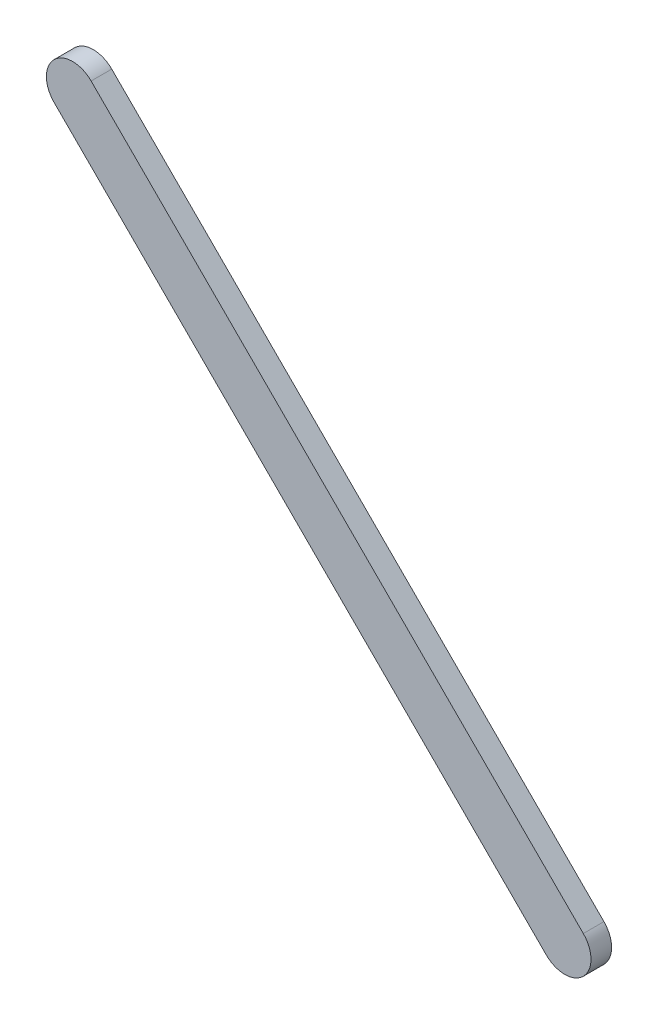
ISO-10303-21;
HEADER;
FILE_DESCRIPTION(('STEP AP214'),'2;1');
FILE_NAME('part.step','',(''),(''),'','','');
FILE_SCHEMA(('AUTOMOTIVE_DESIGN { 1 0 10303 214 1 1 1 1 }'));
ENDSEC;
DATA;
#1=APPLICATION_CONTEXT('core data for automotive mechanical design processes');
#2=APPLICATION_PROTOCOL_DEFINITION('international standard','automotive_design',2000,#1);
#3=PRODUCT_CONTEXT('',#1,'mechanical');
#4=PRODUCT('Part','Part','',(#3));
#5=PRODUCT_RELATED_PRODUCT_CATEGORY('part','',(#4));
#6=PRODUCT_DEFINITION_FORMATION('','',#4);
#7=PRODUCT_DEFINITION_CONTEXT('part definition',#1,'design');
#8=PRODUCT_DEFINITION('design','',#6,#7);
#9=PRODUCT_DEFINITION_SHAPE('','',#8);
#10=(LENGTH_UNIT() NAMED_UNIT(*) SI_UNIT(.MILLI.,.METRE.));
#11=(NAMED_UNIT(*) PLANE_ANGLE_UNIT() SI_UNIT($,.RADIAN.));
#12=(NAMED_UNIT(*) SI_UNIT($,.STERADIAN.) SOLID_ANGLE_UNIT());
#13=UNCERTAINTY_MEASURE_WITH_UNIT(LENGTH_MEASURE(1.E-05),#10,'distance_accuracy_value','');
#14=(GEOMETRIC_REPRESENTATION_CONTEXT(3) GLOBAL_UNCERTAINTY_ASSIGNED_CONTEXT((#13)) GLOBAL_UNIT_ASSIGNED_CONTEXT((#10,
#11,#12)) REPRESENTATION_CONTEXT('',''));
#15=CARTESIAN_POINT('',(0.,0.,0.));
#16=DIRECTION('',(0.,0.,1.));
#17=DIRECTION('',(1.,0.,0.));
#18=AXIS2_PLACEMENT_3D('',#15,#16,#17);
#19=CARTESIAN_POINT('',(137.03266726,101.0393966,0.));
#20=DIRECTION('',(0.707106781186548,0.707106781186548,0.));
#21=DIRECTION('',(0.707106781186548,-0.707106781186548,0.));
#22=AXIS2_PLACEMENT_3D('',#19,#20,#21);
#23=PLANE('',#22);
#24=DIRECTION('',(0.707106781186548,-0.707106781186548,0.));
#25=VECTOR('',#24,1.);
#26=CARTESIAN_POINT('',(137.03266726,101.0393966,0.1999996));
#27=LINE('',#26,#25);
#28=CARTESIAN_POINT('',(137.03266726,101.0393966,0.1999996));
#29=VERTEX_POINT('',#28);
#30=CARTESIAN_POINT('',(141.8063966,96.26566726,0.1999996));
#31=VERTEX_POINT('',#30);
#32=EDGE_CURVE('E11',#29,#31,#27,.T.);
#33=ORIENTED_EDGE('',*,*,#32,.F.);
#34=DIRECTION('',(0.,0.,1.));
#35=VECTOR('',#34,1.);
#36=CARTESIAN_POINT('',(137.03266726,101.0393966,0.));
#37=LINE('',#36,#35);
#38=CARTESIAN_POINT('',(137.03266726,101.0393966,0.));
#39=VERTEX_POINT('',#38);
#40=EDGE_CURVE('E24',#39,#29,#37,.T.);
#41=ORIENTED_EDGE('',*,*,#40,.F.);
#42=DIRECTION('',(0.707106781186548,-0.707106781186548,0.));
#43=VECTOR('',#42,1.);
#44=CARTESIAN_POINT('',(137.03266726,101.0393966,0.));
#45=LINE('',#44,#43);
#46=CARTESIAN_POINT('',(141.8063966,96.26566726,0.));
#47=VERTEX_POINT('',#46);
#48=EDGE_CURVE('E75',#39,#47,#45,.T.);
#49=ORIENTED_EDGE('',*,*,#48,.T.);
#50=DIRECTION('',(0.,0.,1.));
#51=VECTOR('',#50,1.);
#52=CARTESIAN_POINT('',(141.8063966,96.26566726,0.));
#53=LINE('',#52,#51);
#54=EDGE_CURVE('E37',#47,#31,#53,.T.);
#55=ORIENTED_EDGE('',*,*,#54,.T.);
#56=EDGE_LOOP('',(#33,#41,#49,#55));
#57=FACE_BOUND('',#56,.T.);
#58=ADVANCED_FACE('F17',(#57),#23,.F.);
#59=CARTESIAN_POINT('',(141.98600127,96.44527193,0.));
#60=DIRECTION('',(0.,0.,-1.));
#61=DIRECTION('',(-0.707106781186492,-0.707106781186603,0.));
#62=AXIS2_PLACEMENT_3D('',#59,#60,#61);
#63=CYLINDRICAL_SURFACE('',#62,0.253999360179542);
#64=CARTESIAN_POINT('',(141.98600127,96.44527193,0.1999996));
#65=DIRECTION('',(0.,0.,1.));
#66=DIRECTION('',(-0.707106781186492,-0.707106781186603,0.));
#67=AXIS2_PLACEMENT_3D('',#64,#65,#66);
#68=CIRCLE('',#67,0.253999360179542);
#69=CARTESIAN_POINT('',(142.16560594,96.6248766,0.1999996));
#70=VERTEX_POINT('',#69);
#71=EDGE_CURVE('E83',#31,#70,#68,.T.);
#72=ORIENTED_EDGE('',*,*,#71,.F.);
#73=ORIENTED_EDGE('',*,*,#54,.F.);
#74=CARTESIAN_POINT('',(141.98600127,96.44527193,0.));
#75=DIRECTION('',(0.,0.,1.));
#76=DIRECTION('',(-0.707106781186492,-0.707106781186603,0.));
#77=AXIS2_PLACEMENT_3D('',#74,#75,#76);
#78=CIRCLE('',#77,0.253999360179542);
#79=CARTESIAN_POINT('',(142.16560594,96.6248766,0.));
#80=VERTEX_POINT('',#79);
#81=EDGE_CURVE('E81',#47,#80,#78,.T.);
#82=ORIENTED_EDGE('',*,*,#81,.T.);
#83=DIRECTION('',(0.,0.,1.));
#84=VECTOR('',#83,1.);
#85=CARTESIAN_POINT('',(142.16560594,96.6248766,0.));
#86=LINE('',#85,#84);
#87=EDGE_CURVE('E67',#80,#70,#86,.T.);
#88=ORIENTED_EDGE('',*,*,#87,.T.);
#89=EDGE_LOOP('',(#72,#73,#82,#88));
#90=FACE_BOUND('',#89,.T.);
#91=ADVANCED_FACE('F89',(#90),#63,.T.);
#92=CARTESIAN_POINT('',(142.16560594,96.6248766,0.));
#93=DIRECTION('',(-0.707106781186549,-0.707106781186546,0.));
#94=DIRECTION('',(-0.707106781186546,0.707106781186549,0.));
#95=AXIS2_PLACEMENT_3D('',#92,#93,#94);
#96=PLANE('',#95);
#97=DIRECTION('',(-0.707106781186546,0.707106781186549,0.));
#98=VECTOR('',#97,1.);
#99=CARTESIAN_POINT('',(142.16560594,96.6248766,0.1999996));
#100=LINE('',#99,#98);
#101=CARTESIAN_POINT('',(137.3918766,101.39860594,0.1999996));
#102=VERTEX_POINT('',#101);
#103=EDGE_CURVE('E71',#70,#102,#100,.T.);
#104=ORIENTED_EDGE('',*,*,#103,.F.);
#105=ORIENTED_EDGE('',*,*,#87,.F.);
#106=DIRECTION('',(-0.707106781186546,0.707106781186549,0.));
#107=VECTOR('',#106,1.);
#108=CARTESIAN_POINT('',(142.16560594,96.6248766,0.));
#109=LINE('',#108,#107);
#110=CARTESIAN_POINT('',(137.3918766,101.39860594,0.));
#111=VERTEX_POINT('',#110);
#112=EDGE_CURVE('E63',#80,#111,#109,.T.);
#113=ORIENTED_EDGE('',*,*,#112,.T.);
#114=DIRECTION('',(0.,0.,1.));
#115=VECTOR('',#114,1.);
#116=CARTESIAN_POINT('',(137.3918766,101.39860594,0.));
#117=LINE('',#116,#115);
#118=EDGE_CURVE('E53',#111,#102,#117,.T.);
#119=ORIENTED_EDGE('',*,*,#118,.T.);
#120=EDGE_LOOP('',(#104,#105,#113,#119));
#121=FACE_BOUND('',#120,.T.);
#122=ADVANCED_FACE('F66',(#121),#96,.F.);
#123=CARTESIAN_POINT('',(137.21227193,101.21900127,0.));
#124=DIRECTION('',(0.,0.,-1.));
#125=DIRECTION('',(0.707106781186576,0.70710678118652,0.));
#126=AXIS2_PLACEMENT_3D('',#123,#124,#125);
#127=CYLINDRICAL_SURFACE('',#126,0.253999360179542);
#128=CARTESIAN_POINT('',(137.21227193,101.21900127,0.1999996));
#129=DIRECTION('',(0.,0.,1.));
#130=DIRECTION('',(0.707106781186576,0.70710678118652,0.));
#131=AXIS2_PLACEMENT_3D('',#128,#129,#130);
#132=CIRCLE('',#131,0.253999360179542);
#133=EDGE_CURVE('E59',#102,#29,#132,.T.);
#134=ORIENTED_EDGE('',*,*,#133,.F.);
#135=ORIENTED_EDGE('',*,*,#118,.F.);
#136=CARTESIAN_POINT('',(137.21227193,101.21900127,0.));
#137=DIRECTION('',(0.,0.,1.));
#138=DIRECTION('',(0.707106781186576,0.70710678118652,0.));
#139=AXIS2_PLACEMENT_3D('',#136,#137,#138);
#140=CIRCLE('',#139,0.253999360179542);
#141=EDGE_CURVE('E57',#111,#39,#140,.T.);
#142=ORIENTED_EDGE('',*,*,#141,.T.);
#143=ORIENTED_EDGE('',*,*,#40,.T.);
#144=EDGE_LOOP('',(#134,#135,#142,#143));
#145=FACE_BOUND('',#144,.T.);
#146=ADVANCED_FACE('F55',(#145),#127,.T.);
#147=CARTESIAN_POINT('',(137.03266726,101.0393966,0.));
#148=DIRECTION('',(0.,0.,-1.));
#149=DIRECTION('',(-1.,0.,0.));
#150=AXIS2_PLACEMENT_3D('',#147,#148,#149);
#151=PLANE('',#150);
#152=ORIENTED_EDGE('',*,*,#141,.F.);
#153=ORIENTED_EDGE('',*,*,#112,.F.);
#154=ORIENTED_EDGE('',*,*,#81,.F.);
#155=ORIENTED_EDGE('',*,*,#48,.F.);
#156=EDGE_LOOP('',(#152,#153,#154,#155));
#157=FACE_BOUND('',#156,.T.);
#158=ADVANCED_FACE('F74',(#157),#151,.T.);
#159=CARTESIAN_POINT('',(137.03266726,101.0393966,0.1999996));
#160=DIRECTION('',(0.,0.,-1.));
#161=DIRECTION('',(-1.,0.,0.));
#162=AXIS2_PLACEMENT_3D('',#159,#160,#161);
#163=PLANE('',#162);
#164=ORIENTED_EDGE('',*,*,#32,.T.);
#165=ORIENTED_EDGE('',*,*,#71,.T.);
#166=ORIENTED_EDGE('',*,*,#103,.T.);
#167=ORIENTED_EDGE('',*,*,#133,.T.);
#168=EDGE_LOOP('',(#164,#165,#166,#167));
#169=FACE_BOUND('',#168,.T.);
#170=ADVANCED_FACE('F91',(#169),#163,.F.);
#171=CLOSED_SHELL('',(#58,#91,#122,#146,#158,#170));
#172=MANIFOLD_SOLID_BREP('B1',#171);
#173=ADVANCED_BREP_SHAPE_REPRESENTATION('',(#18,#172),#14);
#174=SHAPE_DEFINITION_REPRESENTATION(#9,#173);
ENDSEC;
END-ISO-10303-21;
